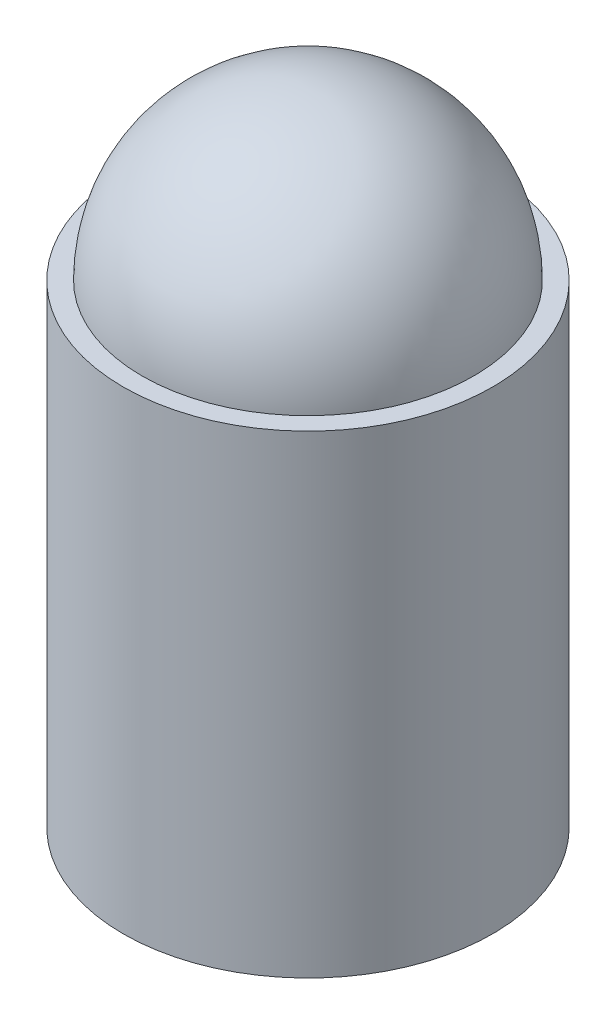
ISO-10303-21;
HEADER;
FILE_DESCRIPTION(('STEP AP214'),'2;1');
FILE_NAME('part.step','',(''),(''),'','','');
FILE_SCHEMA(('AUTOMOTIVE_DESIGN { 1 0 10303 214 1 1 1 1 }'));
ENDSEC;
DATA;
#1=APPLICATION_CONTEXT('core data for automotive mechanical design processes');
#2=APPLICATION_PROTOCOL_DEFINITION('international standard','automotive_design',2000,#1);
#3=PRODUCT_CONTEXT('',#1,'mechanical');
#4=PRODUCT('Part','Part','',(#3));
#5=PRODUCT_RELATED_PRODUCT_CATEGORY('part','',(#4));
#6=PRODUCT_DEFINITION_FORMATION('','',#4);
#7=PRODUCT_DEFINITION_CONTEXT('part definition',#1,'design');
#8=PRODUCT_DEFINITION('design','',#6,#7);
#9=PRODUCT_DEFINITION_SHAPE('','',#8);
#10=(LENGTH_UNIT() NAMED_UNIT(*) SI_UNIT(.MILLI.,.METRE.));
#11=(NAMED_UNIT(*) PLANE_ANGLE_UNIT() SI_UNIT($,.RADIAN.));
#12=(NAMED_UNIT(*) SI_UNIT($,.STERADIAN.) SOLID_ANGLE_UNIT());
#13=UNCERTAINTY_MEASURE_WITH_UNIT(LENGTH_MEASURE(1.E-05),#10,'distance_accuracy_value','');
#14=(GEOMETRIC_REPRESENTATION_CONTEXT(3) GLOBAL_UNCERTAINTY_ASSIGNED_CONTEXT((#13)) GLOBAL_UNIT_ASSIGNED_CONTEXT((#10,
#11,#12)) REPRESENTATION_CONTEXT('',''));
#15=CARTESIAN_POINT('',(0.,0.,0.));
#16=DIRECTION('',(0.,0.,1.));
#17=DIRECTION('',(1.,0.,0.));
#18=AXIS2_PLACEMENT_3D('',#15,#16,#17);
#19=CARTESIAN_POINT('',(0.,0.,0.));
#20=DIRECTION('',(-1.,0.,0.));
#21=DIRECTION('',(0.,0.,-1.));
#22=AXIS2_PLACEMENT_3D('',#19,#20,#21);
#23=SPHERICAL_SURFACE('',#22,4.445);
#24=CARTESIAN_POINT('',(0.,0.,0.));
#25=DIRECTION('',(0.,1.,0.));
#26=DIRECTION('',(0.,0.,1.));
#27=AXIS2_PLACEMENT_3D('',#24,#25,#26);
#28=SPHERICAL_SURFACE('',#27,4.445);
#29=CARTESIAN_POINT('',(0.,0.,0.));
#30=DIRECTION('',(0.,1.,0.));
#31=DIRECTION('',(0.,0.,1.));
#32=AXIS2_PLACEMENT_3D('',#29,#30,#31);
#33=CIRCLE('',#32,4.445);
#34=CARTESIAN_POINT('',(0.,0.,4.445));
#35=VERTEX_POINT('',#34);
#36=EDGE_CURVE('E10',#35,#35,#33,.F.);
#37=ORIENTED_EDGE('',*,*,#36,.F.);
#38=EDGE_LOOP('',(#37));
#39=FACE_BOUND('',#38,.T.);
#40=ADVANCED_FACE('F37',(#39),#28,.T.);
#41=CARTESIAN_POINT('',(0.,-12.7,0.));
#42=DIRECTION('',(0.,1.,0.));
#43=DIRECTION('',(0.,0.,1.));
#44=AXIS2_PLACEMENT_3D('',#41,#42,#43);
#45=CYLINDRICAL_SURFACE('',#44,4.953);
#46=CARTESIAN_POINT('',(0.,-12.7,0.));
#47=DIRECTION('',(0.,1.,0.));
#48=DIRECTION('',(0.,0.,1.));
#49=AXIS2_PLACEMENT_3D('',#46,#47,#48);
#50=CIRCLE('',#49,4.953);
#51=CARTESIAN_POINT('',(0.,-12.7,4.953));
#52=VERTEX_POINT('',#51);
#53=EDGE_CURVE('E43',#52,#52,#50,.T.);
#54=ORIENTED_EDGE('',*,*,#53,.T.);
#55=EDGE_LOOP('',(#54));
#56=FACE_BOUND('',#55,.T.);
#57=CARTESIAN_POINT('',(0.,0.,0.));
#58=DIRECTION('',(0.,1.,0.));
#59=DIRECTION('',(0.,0.,1.));
#60=AXIS2_PLACEMENT_3D('',#57,#58,#59);
#61=CIRCLE('',#60,4.953);
#62=CARTESIAN_POINT('',(0.,0.,4.953));
#63=VERTEX_POINT('',#62);
#64=EDGE_CURVE('E47',#63,#63,#61,.T.);
#65=ORIENTED_EDGE('',*,*,#64,.F.);
#66=EDGE_LOOP('',(#65));
#67=FACE_BOUND('',#66,.T.);
#68=ADVANCED_FACE('F56',(#56,#67),#45,.T.);
#69=CARTESIAN_POINT('',(0.,-12.7,0.));
#70=DIRECTION('',(0.,1.,0.));
#71=DIRECTION('',(0.,0.,1.));
#72=AXIS2_PLACEMENT_3D('',#69,#70,#71);
#73=PLANE('',#72);
#74=ORIENTED_EDGE('',*,*,#53,.F.);
#75=EDGE_LOOP('',(#74));
#76=FACE_BOUND('',#75,.T.);
#77=ADVANCED_FACE('F58',(#76),#73,.F.);
#78=CARTESIAN_POINT('',(0.,0.,0.));
#79=DIRECTION('',(0.,1.,0.));
#80=DIRECTION('',(0.,0.,1.));
#81=AXIS2_PLACEMENT_3D('',#78,#79,#80);
#82=PLANE('',#81);
#83=ORIENTED_EDGE('',*,*,#36,.T.);
#84=EDGE_LOOP('',(#83));
#85=FACE_BOUND('',#84,.T.);
#86=ORIENTED_EDGE('',*,*,#64,.T.);
#87=EDGE_LOOP('',(#86));
#88=FACE_BOUND('',#87,.T.);
#89=ADVANCED_FACE('F54',(#85,#88),#82,.T.);
#90=CLOSED_SHELL('',(#40,#68,#77,#89));
#91=MANIFOLD_SOLID_BREP('B2',#90);
#92=ADVANCED_BREP_SHAPE_REPRESENTATION('',(#18,#91),#14);
#93=SHAPE_DEFINITION_REPRESENTATION(#9,#92);
ENDSEC;
END-ISO-10303-21;
